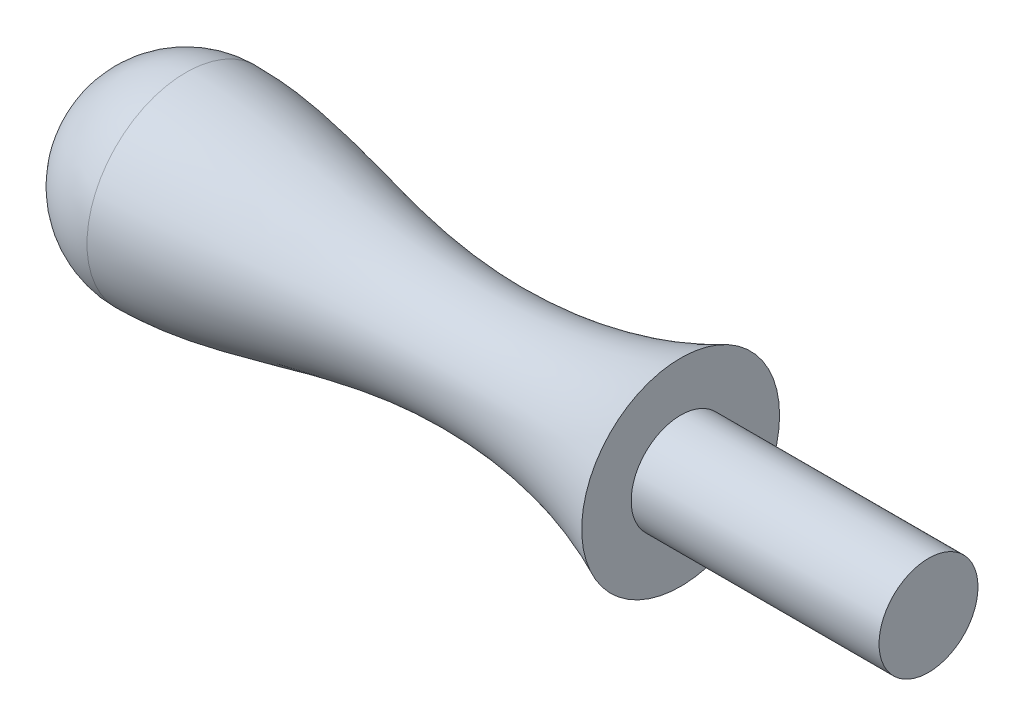
ISO-10303-21;
HEADER;
FILE_DESCRIPTION(('STEP AP214'),'2;1');
FILE_NAME('part.step','',(''),(''),'','','');
FILE_SCHEMA(('AUTOMOTIVE_DESIGN { 1 0 10303 214 1 1 1 1 }'));
ENDSEC;
DATA;
#1=APPLICATION_CONTEXT('core data for automotive mechanical design processes');
#2=APPLICATION_PROTOCOL_DEFINITION('international standard','automotive_design',2000,#1);
#3=PRODUCT_CONTEXT('',#1,'mechanical');
#4=PRODUCT('Part','Part','',(#3));
#5=PRODUCT_RELATED_PRODUCT_CATEGORY('part','',(#4));
#6=PRODUCT_DEFINITION_FORMATION('','',#4);
#7=PRODUCT_DEFINITION_CONTEXT('part definition',#1,'design');
#8=PRODUCT_DEFINITION('design','',#6,#7);
#9=PRODUCT_DEFINITION_SHAPE('','',#8);
#10=(LENGTH_UNIT() NAMED_UNIT(*) SI_UNIT(.MILLI.,.METRE.));
#11=(NAMED_UNIT(*) PLANE_ANGLE_UNIT() SI_UNIT($,.RADIAN.));
#12=(NAMED_UNIT(*) SI_UNIT($,.STERADIAN.) SOLID_ANGLE_UNIT());
#13=UNCERTAINTY_MEASURE_WITH_UNIT(LENGTH_MEASURE(1.E-05),#10,'distance_accuracy_value','');
#14=(GEOMETRIC_REPRESENTATION_CONTEXT(3) GLOBAL_UNCERTAINTY_ASSIGNED_CONTEXT((#13)) GLOBAL_UNIT_ASSIGNED_CONTEXT((#10,
#11,#12)) REPRESENTATION_CONTEXT('',''));
#15=CARTESIAN_POINT('',(0.,0.,0.));
#16=DIRECTION('',(0.,0.,1.));
#17=DIRECTION('',(1.,0.,0.));
#18=AXIS2_PLACEMENT_3D('',#15,#16,#17);
#19=CARTESIAN_POINT('',(0.,0.,-6.35));
#20=CARTESIAN_POINT('',(-5.75017196584729,0.,-3.66305123080805));
#21=CARTESIAN_POINT('',(-16.8937209939469,0.,-2.7635946879617));
#22=CARTESIAN_POINT('',(-27.1705162406024,0.,-6.34999999999999));
#23=CARTESIAN_POINT('',(-31.75,0.,-6.35));
#24=B_SPLINE_CURVE_WITH_KNOTS('',3,(#19,#20,#21,#22,#23),.UNSPECIFIED.,.F.,.F.,(4,1,4),(0.,
0.579529835983861,1.),.UNSPECIFIED.);
#25=CARTESIAN_POINT('',(0.,0.,0.));
#26=DIRECTION('',(1.,0.,0.));
#27=AXIS1_PLACEMENT('',#25,#26);
#28=SURFACE_OF_REVOLUTION('',#24,#27);
#29=CARTESIAN_POINT('',(-31.75,0.,0.));
#30=DIRECTION('',(1.,0.,0.));
#31=DIRECTION('',(0.,0.,-1.));
#32=AXIS2_PLACEMENT_3D('',#29,#30,#31);
#33=CIRCLE('',#32,6.35);
#34=CARTESIAN_POINT('',(-31.75,0.,-6.35));
#35=VERTEX_POINT('',#34);
#36=EDGE_CURVE('E36',#35,#35,#33,.T.);
#37=ORIENTED_EDGE('',*,*,#36,.T.);
#38=EDGE_LOOP('',(#37));
#39=FACE_BOUND('',#38,.T.);
#40=CARTESIAN_POINT('',(0.,0.,0.));
#41=DIRECTION('',(1.,0.,0.));
#42=DIRECTION('',(0.,0.,-1.));
#43=AXIS2_PLACEMENT_3D('',#40,#41,#42);
#44=CIRCLE('',#43,6.35);
#45=CARTESIAN_POINT('',(0.,0.,-6.35));
#46=VERTEX_POINT('',#45);
#47=EDGE_CURVE('E44',#46,#46,#44,.T.);
#48=ORIENTED_EDGE('',*,*,#47,.F.);
#49=EDGE_LOOP('',(#48));
#50=FACE_BOUND('',#49,.T.);
#51=ADVANCED_FACE('F32',(#39,#50),#28,.F.);
#52=CARTESIAN_POINT('',(-31.75,0.,0.));
#53=DIRECTION('',(1.,0.,0.));
#54=DIRECTION('',(0.,0.,-1.));
#55=AXIS2_PLACEMENT_3D('',#52,#53,#54);
#56=SPHERICAL_SURFACE('',#55,6.35);
#57=ORIENTED_EDGE('',*,*,#36,.F.);
#58=EDGE_LOOP('',(#57));
#59=FACE_BOUND('',#58,.T.);
#60=ADVANCED_FACE('F70',(#59),#56,.T.);
#61=CARTESIAN_POINT('',(0.,0.,-6.35));
#62=DIRECTION('',(1.,0.,0.));
#63=DIRECTION('',(0.,0.,-1.));
#64=AXIS2_PLACEMENT_3D('',#61,#62,#63);
#65=PLANE('',#64);
#66=CARTESIAN_POINT('',(0.,0.,0.));
#67=DIRECTION('',(1.,0.,0.));
#68=DIRECTION('',(0.,0.,-1.));
#69=AXIS2_PLACEMENT_3D('',#66,#67,#68);
#70=CIRCLE('',#69,3.175);
#71=CARTESIAN_POINT('',(0.,0.,-3.175));
#72=VERTEX_POINT('',#71);
#73=EDGE_CURVE('E10',#72,#72,#70,.T.);
#74=ORIENTED_EDGE('',*,*,#73,.F.);
#75=EDGE_LOOP('',(#74));
#76=FACE_BOUND('',#75,.T.);
#77=ORIENTED_EDGE('',*,*,#47,.T.);
#78=EDGE_LOOP('',(#77));
#79=FACE_BOUND('',#78,.T.);
#80=ADVANCED_FACE('F63',(#76,#79),#65,.T.);
#81=CARTESIAN_POINT('',(15.9091191872929,0.,0.));
#82=DIRECTION('',(-1.,0.,0.));
#83=DIRECTION('',(0.,0.,1.));
#84=AXIS2_PLACEMENT_3D('',#81,#82,#83);
#85=CYLINDRICAL_SURFACE('',#84,3.175);
#86=CARTESIAN_POINT('',(15.9091191872929,0.,0.));
#87=DIRECTION('',(1.,0.,0.));
#88=DIRECTION('',(0.,0.,-1.));
#89=AXIS2_PLACEMENT_3D('',#86,#87,#88);
#90=CIRCLE('',#89,3.175);
#91=CARTESIAN_POINT('',(15.9091191872929,0.,-3.175));
#92=VERTEX_POINT('',#91);
#93=EDGE_CURVE('E46',#92,#92,#90,.T.);
#94=ORIENTED_EDGE('',*,*,#93,.F.);
#95=EDGE_LOOP('',(#94));
#96=FACE_BOUND('',#95,.T.);
#97=ORIENTED_EDGE('',*,*,#73,.T.);
#98=EDGE_LOOP('',(#97));
#99=FACE_BOUND('',#98,.T.);
#100=ADVANCED_FACE('F61',(#96,#99),#85,.T.);
#101=CARTESIAN_POINT('',(15.9091191872929,0.,0.));
#102=DIRECTION('',(1.,0.,0.));
#103=DIRECTION('',(0.,0.,-1.));
#104=AXIS2_PLACEMENT_3D('',#101,#102,#103);
#105=PLANE('',#104);
#106=ORIENTED_EDGE('',*,*,#93,.T.);
#107=EDGE_LOOP('',(#106));
#108=FACE_BOUND('',#107,.T.);
#109=ADVANCED_FACE('F59',(#108),#105,.T.);
#110=CLOSED_SHELL('',(#51,#60,#80,#100,#109));
#111=MANIFOLD_SOLID_BREP('B2',#110);
#112=ADVANCED_BREP_SHAPE_REPRESENTATION('',(#18,#111),#14);
#113=SHAPE_DEFINITION_REPRESENTATION(#9,#112);
ENDSEC;
END-ISO-10303-21;
